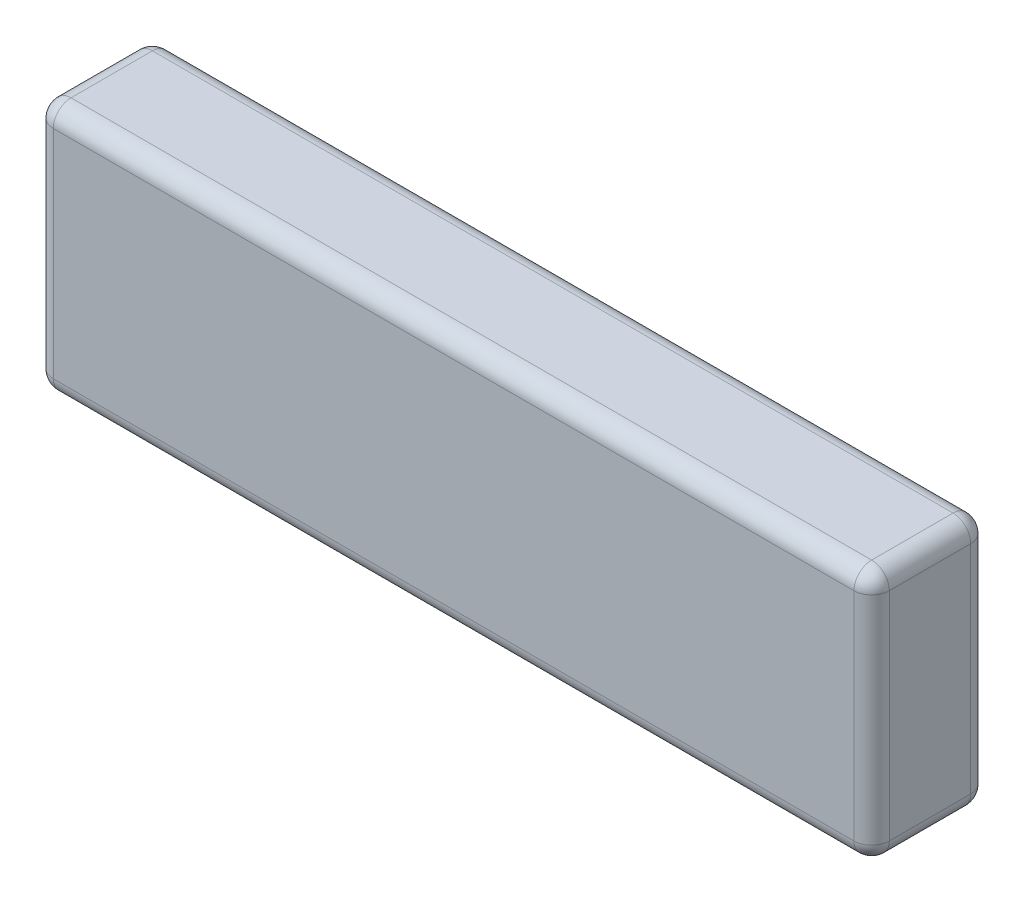
ISO-10303-21;
HEADER;
FILE_DESCRIPTION(('STEP AP214'),'2;1');
FILE_NAME('part.step','',(''),(''),'','','');
FILE_SCHEMA(('AUTOMOTIVE_DESIGN { 1 0 10303 214 1 1 1 1 }'));
ENDSEC;
DATA;
#1=APPLICATION_CONTEXT('core data for automotive mechanical design processes');
#2=APPLICATION_PROTOCOL_DEFINITION('international standard','automotive_design',2000,#1);
#3=PRODUCT_CONTEXT('',#1,'mechanical');
#4=PRODUCT('Part','Part','',(#3));
#5=PRODUCT_RELATED_PRODUCT_CATEGORY('part','',(#4));
#6=PRODUCT_DEFINITION_FORMATION('','',#4);
#7=PRODUCT_DEFINITION_CONTEXT('part definition',#1,'design');
#8=PRODUCT_DEFINITION('design','',#6,#7);
#9=PRODUCT_DEFINITION_SHAPE('','',#8);
#10=(LENGTH_UNIT() NAMED_UNIT(*) SI_UNIT(.MILLI.,.METRE.));
#11=(NAMED_UNIT(*) PLANE_ANGLE_UNIT() SI_UNIT($,.RADIAN.));
#12=(NAMED_UNIT(*) SI_UNIT($,.STERADIAN.) SOLID_ANGLE_UNIT());
#13=UNCERTAINTY_MEASURE_WITH_UNIT(LENGTH_MEASURE(1.E-05),#10,'distance_accuracy_value','');
#14=(GEOMETRIC_REPRESENTATION_CONTEXT(3) GLOBAL_UNCERTAINTY_ASSIGNED_CONTEXT((#13)) GLOBAL_UNIT_ASSIGNED_CONTEXT((#10,
#11,#12)) REPRESENTATION_CONTEXT('',''));
#15=CARTESIAN_POINT('',(0.,0.,0.));
#16=DIRECTION('',(0.,0.,1.));
#17=DIRECTION('',(1.,0.,0.));
#18=AXIS2_PLACEMENT_3D('',#15,#16,#17);
#19=CARTESIAN_POINT('',(-45.25,12.25,4.6));
#20=DIRECTION('',(0.,0.707106781186548,-0.707106781186548));
#21=DIRECTION('',(-1.,1.3890755389666E-08,1.3890756277845E-08));
#22=AXIS2_PLACEMENT_3D('',#19,#20,#21);
#23=SPHERICAL_SURFACE('',#22,2.);
#24=CARTESIAN_POINT('',(-45.25,12.25,4.6));
#25=DIRECTION('',(-1.,0.,0.));
#26=DIRECTION('',(0.,0.,1.));
#27=AXIS2_PLACEMENT_3D('',#24,#25,#26);
#28=CIRCLE('',#27,2.);
#29=CARTESIAN_POINT('',(-45.25,12.25,6.6));
#30=VERTEX_POINT('',#29);
#31=CARTESIAN_POINT('',(-45.25,14.25,4.6));
#32=VERTEX_POINT('',#31);
#33=EDGE_CURVE('E10',#30,#32,#28,.T.);
#34=ORIENTED_EDGE('',*,*,#33,.T.);
#35=CARTESIAN_POINT('',(-45.25,12.25,4.6));
#36=DIRECTION('',(0.,0.,1.));
#37=DIRECTION('',(0.,1.,0.));
#38=AXIS2_PLACEMENT_3D('',#35,#36,#37);
#39=CIRCLE('',#38,2.);
#40=CARTESIAN_POINT('',(-47.25,12.25,4.6));
#41=VERTEX_POINT('',#40);
#42=EDGE_CURVE('E304',#32,#41,#39,.T.);
#43=ORIENTED_EDGE('',*,*,#42,.T.);
#44=CARTESIAN_POINT('',(-45.25,12.25,4.6));
#45=DIRECTION('',(0.,1.,0.));
#46=DIRECTION('',(-1.,0.,0.));
#47=AXIS2_PLACEMENT_3D('',#44,#45,#46);
#48=CIRCLE('',#47,2.);
#49=EDGE_CURVE('E38',#41,#30,#48,.T.);
#50=ORIENTED_EDGE('',*,*,#49,.T.);
#51=EDGE_LOOP('',(#34,#43,#50));
#52=FACE_BOUND('',#51,.T.);
#53=ADVANCED_FACE('F16',(#52),#23,.T.);
#54=CARTESIAN_POINT('',(47.25,12.25,4.6));
#55=DIRECTION('',(-1.,0.,0.));
#56=DIRECTION('',(0.,0.,1.));
#57=AXIS2_PLACEMENT_3D('',#54,#55,#56);
#58=CYLINDRICAL_SURFACE('',#57,2.);
#59=DIRECTION('',(-1.,0.,0.));
#60=VECTOR('',#59,1.);
#61=CARTESIAN_POINT('',(45.25,14.25,4.6));
#62=LINE('',#61,#60);
#63=CARTESIAN_POINT('',(45.25,14.25,4.6));
#64=VERTEX_POINT('',#63);
#65=EDGE_CURVE('E259',#64,#32,#62,.T.);
#66=ORIENTED_EDGE('',*,*,#65,.T.);
#67=ORIENTED_EDGE('',*,*,#33,.F.);
#68=DIRECTION('',(-1.,0.,0.));
#69=VECTOR('',#68,1.);
#70=CARTESIAN_POINT('',(45.25,12.25,6.6));
#71=LINE('',#70,#69);
#72=CARTESIAN_POINT('',(45.25,12.25,6.6));
#73=VERTEX_POINT('',#72);
#74=EDGE_CURVE('E186',#73,#30,#71,.T.);
#75=ORIENTED_EDGE('',*,*,#74,.F.);
#76=CARTESIAN_POINT('',(45.25,12.25,4.6));
#77=DIRECTION('',(1.,0.,0.));
#78=DIRECTION('',(0.,1.,0.));
#79=AXIS2_PLACEMENT_3D('',#76,#77,#78);
#80=CIRCLE('',#79,2.);
#81=EDGE_CURVE('E24',#64,#73,#80,.T.);
#82=ORIENTED_EDGE('',*,*,#81,.F.);
#83=EDGE_LOOP('',(#66,#67,#75,#82));
#84=FACE_BOUND('',#83,.T.);
#85=ADVANCED_FACE('F334',(#84),#58,.T.);
#86=CARTESIAN_POINT('',(45.25,12.25,4.6));
#87=DIRECTION('',(0.707106781186543,0.,-0.707106781186553));
#88=DIRECTION('',(1.3347989380565E-08,1.,1.3347974281532E-08));
#89=AXIS2_PLACEMENT_3D('',#86,#87,#88);
#90=SPHERICAL_SURFACE('',#89,2.);
#91=CARTESIAN_POINT('',(45.25,12.25,4.6));
#92=DIRECTION('',(0.,1.,0.));
#93=DIRECTION('',(0.,0.,1.));
#94=AXIS2_PLACEMENT_3D('',#91,#92,#93);
#95=CIRCLE('',#94,2.);
#96=CARTESIAN_POINT('',(47.25,12.25,4.6));
#97=VERTEX_POINT('',#96);
#98=EDGE_CURVE('E317',#73,#97,#95,.T.);
#99=ORIENTED_EDGE('',*,*,#98,.T.);
#100=CARTESIAN_POINT('',(45.25,12.25,4.6));
#101=DIRECTION('',(0.,0.,1.));
#102=DIRECTION('',(1.,0.,0.));
#103=AXIS2_PLACEMENT_3D('',#100,#101,#102);
#104=CIRCLE('',#103,2.);
#105=EDGE_CURVE('E146',#97,#64,#104,.T.);
#106=ORIENTED_EDGE('',*,*,#105,.T.);
#107=ORIENTED_EDGE('',*,*,#81,.T.);
#108=EDGE_LOOP('',(#99,#106,#107));
#109=FACE_BOUND('',#108,.T.);
#110=ADVANCED_FACE('F324',(#109),#90,.T.);
#111=CARTESIAN_POINT('',(45.25,-14.25,4.6));
#112=DIRECTION('',(0.,1.,0.));
#113=DIRECTION('',(0.,0.,1.));
#114=AXIS2_PLACEMENT_3D('',#111,#112,#113);
#115=CYLINDRICAL_SURFACE('',#114,2.);
#116=DIRECTION('',(0.,1.,0.));
#117=VECTOR('',#116,1.);
#118=CARTESIAN_POINT('',(47.25,-12.25,4.6));
#119=LINE('',#118,#117);
#120=CARTESIAN_POINT('',(47.25,-12.25,4.6));
#121=VERTEX_POINT('',#120);
#122=EDGE_CURVE('E193',#121,#97,#119,.T.);
#123=ORIENTED_EDGE('',*,*,#122,.T.);
#124=ORIENTED_EDGE('',*,*,#98,.F.);
#125=DIRECTION('',(0.,1.,0.));
#126=VECTOR('',#125,1.);
#127=CARTESIAN_POINT('',(45.25,-12.25,6.6));
#128=LINE('',#127,#126);
#129=CARTESIAN_POINT('',(45.25,-12.25,6.6));
#130=VERTEX_POINT('',#129);
#131=EDGE_CURVE('E214',#130,#73,#128,.T.);
#132=ORIENTED_EDGE('',*,*,#131,.F.);
#133=CARTESIAN_POINT('',(45.25,-12.25,4.6));
#134=DIRECTION('',(0.,-1.,0.));
#135=DIRECTION('',(1.,0.,0.));
#136=AXIS2_PLACEMENT_3D('',#133,#134,#135);
#137=CIRCLE('',#136,2.);
#138=EDGE_CURVE('E310',#121,#130,#137,.T.);
#139=ORIENTED_EDGE('',*,*,#138,.F.);
#140=EDGE_LOOP('',(#123,#124,#132,#139));
#141=FACE_BOUND('',#140,.T.);
#142=ADVANCED_FACE('F332',(#141),#115,.T.);
#143=CARTESIAN_POINT('',(45.25,-12.25,4.6));
#144=DIRECTION('',(0.,-0.707106781186548,-0.707106781186548));
#145=DIRECTION('',(1.,-1.3890747396061E-08,1.3890756721934E-08));
#146=AXIS2_PLACEMENT_3D('',#143,#144,#145);
#147=SPHERICAL_SURFACE('',#146,2.);
#148=CARTESIAN_POINT('',(45.25,-12.25,4.6));
#149=DIRECTION('',(1.,0.,0.));
#150=DIRECTION('',(0.,0.,1.));
#151=AXIS2_PLACEMENT_3D('',#148,#149,#150);
#152=CIRCLE('',#151,2.);
#153=CARTESIAN_POINT('',(45.25,-14.25,4.6));
#154=VERTEX_POINT('',#153);
#155=EDGE_CURVE('E315',#130,#154,#152,.T.);
#156=ORIENTED_EDGE('',*,*,#155,.T.);
#157=CARTESIAN_POINT('',(45.25,-12.25,4.6));
#158=DIRECTION('',(0.,0.,1.));
#159=DIRECTION('',(0.,-1.,0.));
#160=AXIS2_PLACEMENT_3D('',#157,#158,#159);
#161=CIRCLE('',#160,2.);
#162=EDGE_CURVE('E199',#154,#121,#161,.T.);
#163=ORIENTED_EDGE('',*,*,#162,.T.);
#164=ORIENTED_EDGE('',*,*,#138,.T.);
#165=EDGE_LOOP('',(#156,#163,#164));
#166=FACE_BOUND('',#165,.T.);
#167=ADVANCED_FACE('F342',(#166),#147,.T.);
#168=CARTESIAN_POINT('',(-45.25,14.25,4.6));
#169=DIRECTION('',(0.,-1.,0.));
#170=DIRECTION('',(0.,0.,1.));
#171=AXIS2_PLACEMENT_3D('',#168,#169,#170);
#172=CYLINDRICAL_SURFACE('',#171,2.);
#173=DIRECTION('',(0.,-1.,0.));
#174=VECTOR('',#173,1.);
#175=CARTESIAN_POINT('',(-47.25,12.25,4.6));
#176=LINE('',#175,#174);
#177=CARTESIAN_POINT('',(-47.25,-12.25,4.6));
#178=VERTEX_POINT('',#177);
#179=EDGE_CURVE('E269',#41,#178,#176,.T.);
#180=ORIENTED_EDGE('',*,*,#179,.T.);
#181=CARTESIAN_POINT('',(-45.25,-12.25,4.6));
#182=DIRECTION('',(0.,1.,0.));
#183=DIRECTION('',(-1.,0.,0.));
#184=AXIS2_PLACEMENT_3D('',#181,#182,#183);
#185=CIRCLE('',#184,2.);
#186=CARTESIAN_POINT('',(-45.25,-12.25,6.6));
#187=VERTEX_POINT('',#186);
#188=EDGE_CURVE('E46',#178,#187,#185,.T.);
#189=ORIENTED_EDGE('',*,*,#188,.T.);
#190=DIRECTION('',(0.,-1.,0.));
#191=VECTOR('',#190,1.);
#192=CARTESIAN_POINT('',(-45.25,12.25,6.6));
#193=LINE('',#192,#191);
#194=EDGE_CURVE('E181',#30,#187,#193,.T.);
#195=ORIENTED_EDGE('',*,*,#194,.F.);
#196=ORIENTED_EDGE('',*,*,#49,.F.);
#197=EDGE_LOOP('',(#180,#189,#195,#196));
#198=FACE_BOUND('',#197,.T.);
#199=ADVANCED_FACE('F365',(#198),#172,.T.);
#200=CARTESIAN_POINT('',(-45.25,-12.25,4.6));
#201=DIRECTION('',(0.,-0.707106781186543,-0.707106781186553));
#202=DIRECTION('',(0.,-0.707106781186553,0.707106781186543));
#203=AXIS2_PLACEMENT_3D('',#200,#201,#202);
#204=SPHERICAL_SURFACE('',#203,2.);
#205=CARTESIAN_POINT('',(-45.25,-12.25,4.6));
#206=DIRECTION('',(1.,0.,0.));
#207=DIRECTION('',(0.,0.,1.));
#208=AXIS2_PLACEMENT_3D('',#205,#206,#207);
#209=CIRCLE('',#208,2.);
#210=CARTESIAN_POINT('',(-45.25,-14.25,4.6));
#211=VERTEX_POINT('',#210);
#212=EDGE_CURVE('E308',#187,#211,#209,.T.);
#213=ORIENTED_EDGE('',*,*,#212,.F.);
#214=ORIENTED_EDGE('',*,*,#188,.F.);
#215=CARTESIAN_POINT('',(-45.25,-12.25,4.6));
#216=DIRECTION('',(0.,0.,-1.));
#217=DIRECTION('',(0.,-1.,0.));
#218=AXIS2_PLACEMENT_3D('',#215,#216,#217);
#219=CIRCLE('',#218,2.);
#220=EDGE_CURVE('E159',#211,#178,#219,.T.);
#221=ORIENTED_EDGE('',*,*,#220,.F.);
#222=EDGE_LOOP('',(#213,#214,#221));
#223=FACE_BOUND('',#222,.T.);
#224=ADVANCED_FACE('F364',(#223),#204,.T.);
#225=CARTESIAN_POINT('',(-47.25,-12.25,4.6));
#226=DIRECTION('',(1.,0.,0.));
#227=DIRECTION('',(0.,0.,1.));
#228=AXIS2_PLACEMENT_3D('',#225,#226,#227);
#229=CYLINDRICAL_SURFACE('',#228,2.);
#230=DIRECTION('',(1.,0.,0.));
#231=VECTOR('',#230,1.);
#232=CARTESIAN_POINT('',(-45.25,-12.25,6.6));
#233=LINE('',#232,#231);
#234=EDGE_CURVE('E224',#187,#130,#233,.T.);
#235=ORIENTED_EDGE('',*,*,#234,.F.);
#236=ORIENTED_EDGE('',*,*,#212,.T.);
#237=DIRECTION('',(1.,0.,0.));
#238=VECTOR('',#237,1.);
#239=CARTESIAN_POINT('',(-45.25,-14.25,4.6));
#240=LINE('',#239,#238);
#241=EDGE_CURVE('E211',#211,#154,#240,.T.);
#242=ORIENTED_EDGE('',*,*,#241,.T.);
#243=ORIENTED_EDGE('',*,*,#155,.F.);
#244=EDGE_LOOP('',(#235,#236,#242,#243));
#245=FACE_BOUND('',#244,.T.);
#246=ADVANCED_FACE('F338',(#245),#229,.T.);
#247=CARTESIAN_POINT('',(-45.25,12.25,-6.6));
#248=DIRECTION('',(0.,0.,1.));
#249=DIRECTION('',(0.,1.,0.));
#250=AXIS2_PLACEMENT_3D('',#247,#248,#249);
#251=CYLINDRICAL_SURFACE('',#250,2.);
#252=DIRECTION('',(0.,0.,1.));
#253=VECTOR('',#252,1.);
#254=CARTESIAN_POINT('',(-45.25,14.25,-4.6));
#255=LINE('',#254,#253);
#256=CARTESIAN_POINT('',(-45.25,14.25,-4.6));
#257=VERTEX_POINT('',#256);
#258=EDGE_CURVE('E254',#257,#32,#255,.T.);
#259=ORIENTED_EDGE('',*,*,#258,.F.);
#260=CARTESIAN_POINT('',(-45.25,12.25,-4.6));
#261=DIRECTION('',(0.,0.,1.));
#262=DIRECTION('',(0.,1.,0.));
#263=AXIS2_PLACEMENT_3D('',#260,#261,#262);
#264=CIRCLE('',#263,2.);
#265=CARTESIAN_POINT('',(-47.25,12.25,-4.6));
#266=VERTEX_POINT('',#265);
#267=EDGE_CURVE('E142',#257,#266,#264,.T.);
#268=ORIENTED_EDGE('',*,*,#267,.T.);
#269=DIRECTION('',(0.,0.,1.));
#270=VECTOR('',#269,1.);
#271=CARTESIAN_POINT('',(-47.25,12.25,-4.6));
#272=LINE('',#271,#270);
#273=EDGE_CURVE('E228',#266,#41,#272,.T.);
#274=ORIENTED_EDGE('',*,*,#273,.T.);
#275=ORIENTED_EDGE('',*,*,#42,.F.);
#276=EDGE_LOOP('',(#259,#268,#274,#275));
#277=FACE_BOUND('',#276,.T.);
#278=ADVANCED_FACE('F363',(#277),#251,.T.);
#279=CARTESIAN_POINT('',(-45.25,12.25,-4.6));
#280=DIRECTION('',(0.,0.707106781186548,0.707106781186548));
#281=DIRECTION('',(0.,0.707106781186548,-0.707106781186548));
#282=AXIS2_PLACEMENT_3D('',#279,#280,#281);
#283=SPHERICAL_SURFACE('',#282,2.);
#284=CARTESIAN_POINT('',(-45.25,12.25,-4.6));
#285=DIRECTION('',(1.,0.,0.));
#286=DIRECTION('',(0.,0.,-1.));
#287=AXIS2_PLACEMENT_3D('',#284,#285,#286);
#288=CIRCLE('',#287,2.);
#289=CARTESIAN_POINT('',(-45.25,12.25,-6.6));
#290=VERTEX_POINT('',#289);
#291=EDGE_CURVE('E140',#290,#257,#288,.T.);
#292=ORIENTED_EDGE('',*,*,#291,.F.);
#293=CARTESIAN_POINT('',(-45.25,12.25,-4.6));
#294=DIRECTION('',(0.,-1.,0.));
#295=DIRECTION('',(-1.,0.,0.));
#296=AXIS2_PLACEMENT_3D('',#293,#294,#295);
#297=CIRCLE('',#296,2.);
#298=EDGE_CURVE('E138',#266,#290,#297,.T.);
#299=ORIENTED_EDGE('',*,*,#298,.F.);
#300=ORIENTED_EDGE('',*,*,#267,.F.);
#301=EDGE_LOOP('',(#292,#299,#300));
#302=FACE_BOUND('',#301,.T.);
#303=ADVANCED_FACE('F136',(#302),#283,.T.);
#304=CARTESIAN_POINT('',(47.25,12.25,-4.6));
#305=DIRECTION('',(-1.,0.,0.));
#306=DIRECTION('',(0.,0.,-1.));
#307=AXIS2_PLACEMENT_3D('',#304,#305,#306);
#308=CYLINDRICAL_SURFACE('',#307,2.);
#309=CARTESIAN_POINT('',(45.25,12.25,-4.6));
#310=DIRECTION('',(-1.,0.,0.));
#311=DIRECTION('',(0.,1.,0.));
#312=AXIS2_PLACEMENT_3D('',#309,#310,#311);
#313=CIRCLE('',#312,2.);
#314=CARTESIAN_POINT('',(45.25,14.25,-4.6));
#315=VERTEX_POINT('',#314);
#316=CARTESIAN_POINT('',(45.25,12.25,-6.6));
#317=VERTEX_POINT('',#316);
#318=EDGE_CURVE('E167',#315,#317,#313,.T.);
#319=ORIENTED_EDGE('',*,*,#318,.T.);
#320=DIRECTION('',(-1.,0.,0.));
#321=VECTOR('',#320,1.);
#322=CARTESIAN_POINT('',(45.25,12.25,-6.6));
#323=LINE('',#322,#321);
#324=EDGE_CURVE('E162',#317,#290,#323,.T.);
#325=ORIENTED_EDGE('',*,*,#324,.T.);
#326=ORIENTED_EDGE('',*,*,#291,.T.);
#327=DIRECTION('',(-1.,0.,0.));
#328=VECTOR('',#327,1.);
#329=CARTESIAN_POINT('',(45.25,14.25,-4.6));
#330=LINE('',#329,#328);
#331=EDGE_CURVE('E244',#315,#257,#330,.T.);
#332=ORIENTED_EDGE('',*,*,#331,.F.);
#333=EDGE_LOOP('',(#319,#325,#326,#332));
#334=FACE_BOUND('',#333,.T.);
#335=ADVANCED_FACE('F163',(#334),#308,.T.);
#336=CARTESIAN_POINT('',(45.25,12.25,-6.6));
#337=DIRECTION('',(0.,0.,1.));
#338=DIRECTION('',(1.,0.,0.));
#339=AXIS2_PLACEMENT_3D('',#336,#337,#338);
#340=CYLINDRICAL_SURFACE('',#339,2.);
#341=DIRECTION('',(0.,0.,1.));
#342=VECTOR('',#341,1.);
#343=CARTESIAN_POINT('',(47.25,12.25,-4.6));
#344=LINE('',#343,#342);
#345=CARTESIAN_POINT('',(47.25,12.25,-4.6));
#346=VERTEX_POINT('',#345);
#347=EDGE_CURVE('E192',#346,#97,#344,.T.);
#348=ORIENTED_EDGE('',*,*,#347,.F.);
#349=CARTESIAN_POINT('',(45.25,12.25,-4.6));
#350=DIRECTION('',(0.,0.,1.));
#351=DIRECTION('',(1.,0.,0.));
#352=AXIS2_PLACEMENT_3D('',#349,#350,#351);
#353=CIRCLE('',#352,2.);
#354=EDGE_CURVE('E276',#346,#315,#353,.T.);
#355=ORIENTED_EDGE('',*,*,#354,.T.);
#356=DIRECTION('',(0.,0.,1.));
#357=VECTOR('',#356,1.);
#358=CARTESIAN_POINT('',(45.25,14.25,-4.6));
#359=LINE('',#358,#357);
#360=EDGE_CURVE('E263',#315,#64,#359,.T.);
#361=ORIENTED_EDGE('',*,*,#360,.T.);
#362=ORIENTED_EDGE('',*,*,#105,.F.);
#363=EDGE_LOOP('',(#348,#355,#361,#362));
#364=FACE_BOUND('',#363,.T.);
#365=ADVANCED_FACE('F353',(#364),#340,.T.);
#366=CARTESIAN_POINT('',(45.25,12.25,-4.6));
#367=DIRECTION('',(0.707106781186533,0.,0.707106781186563));
#368=DIRECTION('',(0.707106781186563,0.,-0.707106781186533));
#369=AXIS2_PLACEMENT_3D('',#366,#367,#368);
#370=SPHERICAL_SURFACE('',#369,2.);
#371=CARTESIAN_POINT('',(45.25,12.25,-4.6));
#372=DIRECTION('',(0.,-1.,0.));
#373=DIRECTION('',(0.,0.,-1.));
#374=AXIS2_PLACEMENT_3D('',#371,#372,#373);
#375=CIRCLE('',#374,2.);
#376=EDGE_CURVE('E197',#317,#346,#375,.T.);
#377=ORIENTED_EDGE('',*,*,#376,.F.);
#378=ORIENTED_EDGE('',*,*,#318,.F.);
#379=ORIENTED_EDGE('',*,*,#354,.F.);
#380=EDGE_LOOP('',(#377,#378,#379));
#381=FACE_BOUND('',#380,.T.);
#382=ADVANCED_FACE('F385',(#381),#370,.T.);
#383=CARTESIAN_POINT('',(45.25,-14.25,-4.6));
#384=DIRECTION('',(0.,1.,0.));
#385=DIRECTION('',(0.,0.,-1.));
#386=AXIS2_PLACEMENT_3D('',#383,#384,#385);
#387=CYLINDRICAL_SURFACE('',#386,2.);
#388=CARTESIAN_POINT('',(45.25,-12.25,-4.6));
#389=DIRECTION('',(0.,1.,0.));
#390=DIRECTION('',(1.,0.,0.));
#391=AXIS2_PLACEMENT_3D('',#388,#389,#390);
#392=CIRCLE('',#391,2.);
#393=CARTESIAN_POINT('',(47.25,-12.25,-4.6));
#394=VERTEX_POINT('',#393);
#395=CARTESIAN_POINT('',(45.25,-12.25,-6.6));
#396=VERTEX_POINT('',#395);
#397=EDGE_CURVE('E157',#394,#396,#392,.T.);
#398=ORIENTED_EDGE('',*,*,#397,.T.);
#399=DIRECTION('',(0.,1.,0.));
#400=VECTOR('',#399,1.);
#401=CARTESIAN_POINT('',(45.25,-12.25,-6.6));
#402=LINE('',#401,#400);
#403=EDGE_CURVE('E171',#396,#317,#402,.T.);
#404=ORIENTED_EDGE('',*,*,#403,.T.);
#405=ORIENTED_EDGE('',*,*,#376,.T.);
#406=DIRECTION('',(0.,1.,0.));
#407=VECTOR('',#406,1.);
#408=CARTESIAN_POINT('',(47.25,-12.25,-4.6));
#409=LINE('',#408,#407);
#410=EDGE_CURVE('E198',#394,#346,#409,.T.);
#411=ORIENTED_EDGE('',*,*,#410,.F.);
#412=EDGE_LOOP('',(#398,#404,#405,#411));
#413=FACE_BOUND('',#412,.T.);
#414=ADVANCED_FACE('F379',(#413),#387,.T.);
#415=CARTESIAN_POINT('',(45.25,-12.25,-6.6));
#416=DIRECTION('',(0.,0.,1.));
#417=DIRECTION('',(0.,-1.,0.));
#418=AXIS2_PLACEMENT_3D('',#415,#416,#417);
#419=CYLINDRICAL_SURFACE('',#418,2.);
#420=DIRECTION('',(0.,0.,1.));
#421=VECTOR('',#420,1.);
#422=CARTESIAN_POINT('',(45.25,-14.25,-4.6));
#423=LINE('',#422,#421);
#424=CARTESIAN_POINT('',(45.25,-14.25,-4.6));
#425=VERTEX_POINT('',#424);
#426=EDGE_CURVE('E218',#425,#154,#423,.T.);
#427=ORIENTED_EDGE('',*,*,#426,.F.);
#428=CARTESIAN_POINT('',(45.25,-12.25,-4.6));
#429=DIRECTION('',(0.,0.,1.));
#430=DIRECTION('',(0.,-1.,0.));
#431=AXIS2_PLACEMENT_3D('',#428,#429,#430);
#432=CIRCLE('',#431,2.);
#433=EDGE_CURVE('E270',#425,#394,#432,.T.);
#434=ORIENTED_EDGE('',*,*,#433,.T.);
#435=DIRECTION('',(0.,0.,1.));
#436=VECTOR('',#435,1.);
#437=CARTESIAN_POINT('',(47.25,-12.25,-4.6));
#438=LINE('',#437,#436);
#439=EDGE_CURVE('E241',#394,#121,#438,.T.);
#440=ORIENTED_EDGE('',*,*,#439,.T.);
#441=ORIENTED_EDGE('',*,*,#162,.F.);
#442=EDGE_LOOP('',(#427,#434,#440,#441));
#443=FACE_BOUND('',#442,.T.);
#444=ADVANCED_FACE('F350',(#443),#419,.T.);
#445=CARTESIAN_POINT('',(45.25,-12.25,-4.6));
#446=DIRECTION('',(0.,-0.707106781186543,0.707106781186553));
#447=DIRECTION('',(0.,-0.707106781186553,-0.707106781186543));
#448=AXIS2_PLACEMENT_3D('',#445,#446,#447);
#449=SPHERICAL_SURFACE('',#448,2.);
#450=CARTESIAN_POINT('',(45.25,-12.25,-4.6));
#451=DIRECTION('',(-1.,0.,0.));
#452=DIRECTION('',(0.,0.,-1.));
#453=AXIS2_PLACEMENT_3D('',#450,#451,#452);
#454=CIRCLE('',#453,2.);
#455=EDGE_CURVE('E221',#396,#425,#454,.T.);
#456=ORIENTED_EDGE('',*,*,#455,.F.);
#457=ORIENTED_EDGE('',*,*,#397,.F.);
#458=ORIENTED_EDGE('',*,*,#433,.F.);
#459=EDGE_LOOP('',(#456,#457,#458));
#460=FACE_BOUND('',#459,.T.);
#461=ADVANCED_FACE('F378',(#460),#449,.T.);
#462=CARTESIAN_POINT('',(-45.25,14.25,-4.6));
#463=DIRECTION('',(0.,-1.,0.));
#464=DIRECTION('',(0.,0.,-1.));
#465=AXIS2_PLACEMENT_3D('',#462,#463,#464);
#466=CYLINDRICAL_SURFACE('',#465,2.);
#467=ORIENTED_EDGE('',*,*,#298,.T.);
#468=DIRECTION('',(0.,-1.,0.));
#469=VECTOR('',#468,1.);
#470=CARTESIAN_POINT('',(-45.25,12.25,-6.6));
#471=LINE('',#470,#469);
#472=CARTESIAN_POINT('',(-45.25,-12.25,-6.6));
#473=VERTEX_POINT('',#472);
#474=EDGE_CURVE('E154',#290,#473,#471,.T.);
#475=ORIENTED_EDGE('',*,*,#474,.T.);
#476=CARTESIAN_POINT('',(-45.25,-12.25,-4.6));
#477=DIRECTION('',(0.,-1.,0.));
#478=DIRECTION('',(-1.,0.,0.));
#479=AXIS2_PLACEMENT_3D('',#476,#477,#478);
#480=CIRCLE('',#479,2.);
#481=CARTESIAN_POINT('',(-47.25,-12.25,-4.6));
#482=VERTEX_POINT('',#481);
#483=EDGE_CURVE('E190',#482,#473,#480,.T.);
#484=ORIENTED_EDGE('',*,*,#483,.F.);
#485=DIRECTION('',(0.,-1.,0.));
#486=VECTOR('',#485,1.);
#487=CARTESIAN_POINT('',(-47.25,12.25,-4.6));
#488=LINE('',#487,#486);
#489=EDGE_CURVE('E160',#266,#482,#488,.T.);
#490=ORIENTED_EDGE('',*,*,#489,.F.);
#491=EDGE_LOOP('',(#467,#475,#484,#490));
#492=FACE_BOUND('',#491,.T.);
#493=ADVANCED_FACE('F153',(#492),#466,.T.);
#494=CARTESIAN_POINT('',(-45.25,-12.25,-6.6));
#495=DIRECTION('',(0.,0.,1.));
#496=DIRECTION('',(-1.,0.,0.));
#497=AXIS2_PLACEMENT_3D('',#494,#495,#496);
#498=CYLINDRICAL_SURFACE('',#497,2.);
#499=DIRECTION('',(0.,0.,1.));
#500=VECTOR('',#499,1.);
#501=CARTESIAN_POINT('',(-45.25,-14.25,-4.6));
#502=LINE('',#501,#500);
#503=CARTESIAN_POINT('',(-45.25,-14.25,-4.6));
#504=VERTEX_POINT('',#503);
#505=EDGE_CURVE('E210',#504,#211,#502,.T.);
#506=ORIENTED_EDGE('',*,*,#505,.T.);
#507=ORIENTED_EDGE('',*,*,#220,.T.);
#508=DIRECTION('',(0.,0.,1.));
#509=VECTOR('',#508,1.);
#510=CARTESIAN_POINT('',(-47.25,-12.25,-4.6));
#511=LINE('',#510,#509);
#512=EDGE_CURVE('E272',#482,#178,#511,.T.);
#513=ORIENTED_EDGE('',*,*,#512,.F.);
#514=CARTESIAN_POINT('',(-45.25,-12.25,-4.6));
#515=DIRECTION('',(0.,0.,-1.));
#516=DIRECTION('',(0.,-1.,0.));
#517=AXIS2_PLACEMENT_3D('',#514,#515,#516);
#518=CIRCLE('',#517,2.);
#519=EDGE_CURVE('E189',#504,#482,#518,.T.);
#520=ORIENTED_EDGE('',*,*,#519,.F.);
#521=EDGE_LOOP('',(#506,#507,#513,#520));
#522=FACE_BOUND('',#521,.T.);
#523=ADVANCED_FACE('F369',(#522),#498,.T.);
#524=CARTESIAN_POINT('',(-45.25,-12.25,-4.6));
#525=DIRECTION('',(0.,-0.707106781186548,0.707106781186548));
#526=DIRECTION('',(-1.,-1.3890755389667E-08,-1.3890757166024E-08));
#527=AXIS2_PLACEMENT_3D('',#524,#525,#526);
#528=SPHERICAL_SURFACE('',#527,2.);
#529=CARTESIAN_POINT('',(-45.25,-12.25,-4.6));
#530=DIRECTION('',(-1.,0.,0.));
#531=DIRECTION('',(0.,0.,-1.));
#532=AXIS2_PLACEMENT_3D('',#529,#530,#531);
#533=CIRCLE('',#532,2.);
#534=EDGE_CURVE('E229',#473,#504,#533,.T.);
#535=ORIENTED_EDGE('',*,*,#534,.T.);
#536=ORIENTED_EDGE('',*,*,#519,.T.);
#537=ORIENTED_EDGE('',*,*,#483,.T.);
#538=EDGE_LOOP('',(#535,#536,#537));
#539=FACE_BOUND('',#538,.T.);
#540=ADVANCED_FACE('F423',(#539),#528,.T.);
#541=CARTESIAN_POINT('',(-47.25,-12.25,-4.6));
#542=DIRECTION('',(1.,0.,0.));
#543=DIRECTION('',(0.,0.,-1.));
#544=AXIS2_PLACEMENT_3D('',#541,#542,#543);
#545=CYLINDRICAL_SURFACE('',#544,2.);
#546=ORIENTED_EDGE('',*,*,#455,.T.);
#547=DIRECTION('',(1.,0.,0.));
#548=VECTOR('',#547,1.);
#549=CARTESIAN_POINT('',(-45.25,-14.25,-4.6));
#550=LINE('',#549,#548);
#551=EDGE_CURVE('E184',#504,#425,#550,.T.);
#552=ORIENTED_EDGE('',*,*,#551,.F.);
#553=ORIENTED_EDGE('',*,*,#534,.F.);
#554=DIRECTION('',(1.,0.,0.));
#555=VECTOR('',#554,1.);
#556=CARTESIAN_POINT('',(-45.25,-12.25,-6.6));
#557=LINE('',#556,#555);
#558=EDGE_CURVE('E176',#473,#396,#557,.T.);
#559=ORIENTED_EDGE('',*,*,#558,.T.);
#560=EDGE_LOOP('',(#546,#552,#553,#559));
#561=FACE_BOUND('',#560,.T.);
#562=ADVANCED_FACE('F374',(#561),#545,.T.);
#563=CARTESIAN_POINT('',(-47.25,0.,0.));
#564=DIRECTION('',(-1.,0.,0.));
#565=DIRECTION('',(0.,0.,1.));
#566=AXIS2_PLACEMENT_3D('',#563,#564,#565);
#567=PLANE('',#566);
#568=ORIENTED_EDGE('',*,*,#489,.T.);
#569=ORIENTED_EDGE('',*,*,#512,.T.);
#570=ORIENTED_EDGE('',*,*,#179,.F.);
#571=ORIENTED_EDGE('',*,*,#273,.F.);
#572=EDGE_LOOP('',(#568,#569,#570,#571));
#573=FACE_BOUND('',#572,.T.);
#574=ADVANCED_FACE('F422',(#573),#567,.T.);
#575=CARTESIAN_POINT('',(0.,14.25,0.));
#576=DIRECTION('',(0.,1.,0.));
#577=DIRECTION('',(1.,0.,0.));
#578=AXIS2_PLACEMENT_3D('',#575,#576,#577);
#579=PLANE('',#578);
#580=ORIENTED_EDGE('',*,*,#331,.T.);
#581=ORIENTED_EDGE('',*,*,#258,.T.);
#582=ORIENTED_EDGE('',*,*,#65,.F.);
#583=ORIENTED_EDGE('',*,*,#360,.F.);
#584=EDGE_LOOP('',(#580,#581,#582,#583));
#585=FACE_BOUND('',#584,.T.);
#586=ADVANCED_FACE('F359',(#585),#579,.T.);
#587=CARTESIAN_POINT('',(47.25,0.,0.));
#588=DIRECTION('',(1.,0.,0.));
#589=DIRECTION('',(0.,1.,0.));
#590=AXIS2_PLACEMENT_3D('',#587,#588,#589);
#591=PLANE('',#590);
#592=ORIENTED_EDGE('',*,*,#410,.T.);
#593=ORIENTED_EDGE('',*,*,#347,.T.);
#594=ORIENTED_EDGE('',*,*,#122,.F.);
#595=ORIENTED_EDGE('',*,*,#439,.F.);
#596=EDGE_LOOP('',(#592,#593,#594,#595));
#597=FACE_BOUND('',#596,.T.);
#598=ADVANCED_FACE('F351',(#597),#591,.T.);
#599=CARTESIAN_POINT('',(0.,-14.25,0.));
#600=DIRECTION('',(0.,-1.,0.));
#601=DIRECTION('',(0.,0.,-1.));
#602=AXIS2_PLACEMENT_3D('',#599,#600,#601);
#603=PLANE('',#602);
#604=ORIENTED_EDGE('',*,*,#551,.T.);
#605=ORIENTED_EDGE('',*,*,#426,.T.);
#606=ORIENTED_EDGE('',*,*,#241,.F.);
#607=ORIENTED_EDGE('',*,*,#505,.F.);
#608=EDGE_LOOP('',(#604,#605,#606,#607));
#609=FACE_BOUND('',#608,.T.);
#610=ADVANCED_FACE('F375',(#609),#603,.T.);
#611=CARTESIAN_POINT('',(0.,0.,6.6));
#612=DIRECTION('',(0.,0.,1.));
#613=DIRECTION('',(1.,0.,0.));
#614=AXIS2_PLACEMENT_3D('',#611,#612,#613);
#615=PLANE('',#614);
#616=ORIENTED_EDGE('',*,*,#234,.T.);
#617=ORIENTED_EDGE('',*,*,#131,.T.);
#618=ORIENTED_EDGE('',*,*,#74,.T.);
#619=ORIENTED_EDGE('',*,*,#194,.T.);
#620=EDGE_LOOP('',(#616,#617,#618,#619));
#621=FACE_BOUND('',#620,.T.);
#622=ADVANCED_FACE('F333',(#621),#615,.T.);
#623=CARTESIAN_POINT('',(0.,0.,-6.6));
#624=DIRECTION('',(0.,0.,1.));
#625=DIRECTION('',(1.,0.,0.));
#626=AXIS2_PLACEMENT_3D('',#623,#624,#625);
#627=PLANE('',#626);
#628=ORIENTED_EDGE('',*,*,#474,.F.);
#629=ORIENTED_EDGE('',*,*,#324,.F.);
#630=ORIENTED_EDGE('',*,*,#403,.F.);
#631=ORIENTED_EDGE('',*,*,#558,.F.);
#632=EDGE_LOOP('',(#628,#629,#630,#631));
#633=FACE_BOUND('',#632,.T.);
#634=ADVANCED_FACE('F173',(#633),#627,.F.);
#635=CLOSED_SHELL('',(#53,#85,#110,#142,#167,#199,#224,#246,#278,#303,#335,#365,#382,#414,#444,
#461,#493,#523,#540,#562,#574,#586,#598,#610,#622,#634));
#636=MANIFOLD_SOLID_BREP('B1',#635);
#637=ADVANCED_BREP_SHAPE_REPRESENTATION('',(#18,#636),#14);
#638=SHAPE_DEFINITION_REPRESENTATION(#9,#637);
ENDSEC;
END-ISO-10303-21;
